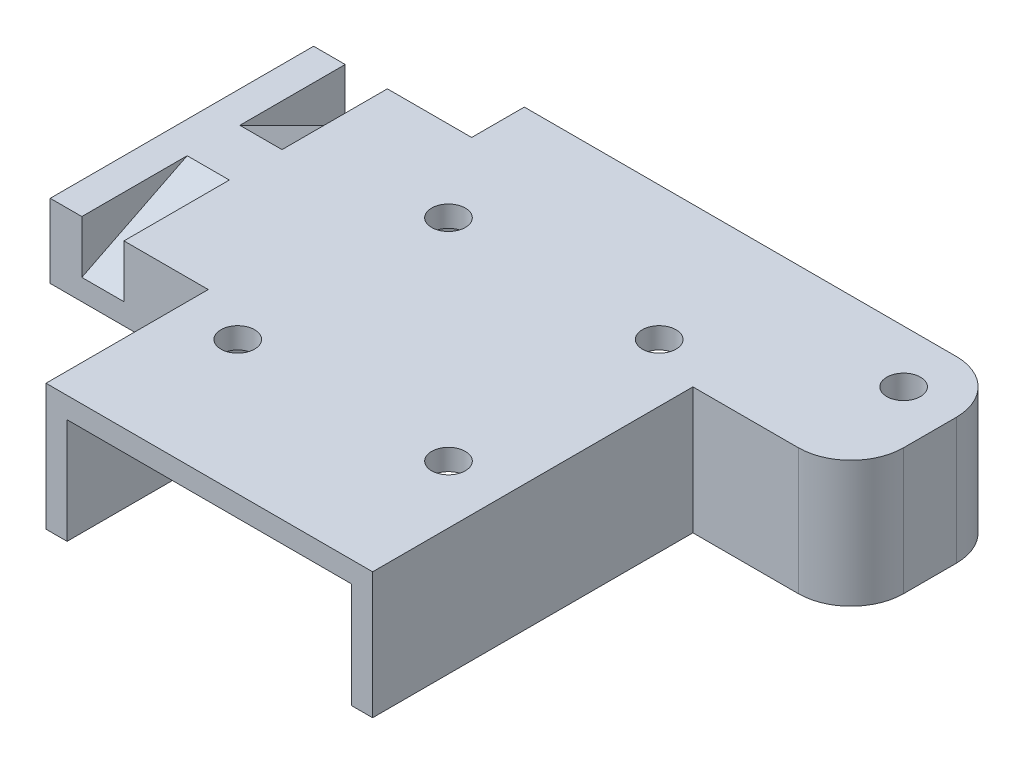
ISO-10303-21;
HEADER;
FILE_DESCRIPTION(('STEP AP214'),'2;1');
FILE_NAME('part.step','',(''),(''),'','','');
FILE_SCHEMA(('AUTOMOTIVE_DESIGN { 1 0 10303 214 1 1 1 1 }'));
ENDSEC;
DATA;
#1=APPLICATION_CONTEXT('core data for automotive mechanical design processes');
#2=APPLICATION_PROTOCOL_DEFINITION('international standard','automotive_design',2000,#1);
#3=PRODUCT_CONTEXT('',#1,'mechanical');
#4=PRODUCT('Part','Part','',(#3));
#5=PRODUCT_RELATED_PRODUCT_CATEGORY('part','',(#4));
#6=PRODUCT_DEFINITION_FORMATION('','',#4);
#7=PRODUCT_DEFINITION_CONTEXT('part definition',#1,'design');
#8=PRODUCT_DEFINITION('design','',#6,#7);
#9=PRODUCT_DEFINITION_SHAPE('','',#8);
#10=(LENGTH_UNIT() NAMED_UNIT(*) SI_UNIT(.MILLI.,.METRE.));
#11=(NAMED_UNIT(*) PLANE_ANGLE_UNIT() SI_UNIT($,.RADIAN.));
#12=(NAMED_UNIT(*) SI_UNIT($,.STERADIAN.) SOLID_ANGLE_UNIT());
#13=UNCERTAINTY_MEASURE_WITH_UNIT(LENGTH_MEASURE(1.E-05),#10,'distance_accuracy_value','');
#14=(GEOMETRIC_REPRESENTATION_CONTEXT(3) GLOBAL_UNCERTAINTY_ASSIGNED_CONTEXT((#13)) GLOBAL_UNIT_ASSIGNED_CONTEXT((#10,
#11,#12)) REPRESENTATION_CONTEXT('',''));
#15=CARTESIAN_POINT('',(0.,0.,0.));
#16=DIRECTION('',(0.,0.,1.));
#17=DIRECTION('',(1.,0.,0.));
#18=AXIS2_PLACEMENT_3D('',#15,#16,#17);
#19=CARTESIAN_POINT('',(62.,12.,-90.8));
#20=DIRECTION('',(0.,-1.,0.));
#21=DIRECTION('',(0.,0.,1.));
#22=AXIS2_PLACEMENT_3D('',#19,#20,#21);
#23=PLANE('',#22);
#24=CARTESIAN_POINT('',(36.5,12.,-58.1));
#25=DIRECTION('',(0.,1.,0.));
#26=DIRECTION('',(0.,0.,-1.));
#27=AXIS2_PLACEMENT_3D('',#24,#25,#26);
#28=CIRCLE('',#27,1.6);
#29=CARTESIAN_POINT('',(36.5,12.,-59.7));
#30=VERTEX_POINT('',#29);
#31=EDGE_CURVE('E372',#30,#30,#28,.T.);
#32=ORIENTED_EDGE('',*,*,#31,.F.);
#33=EDGE_LOOP('',(#32));
#34=FACE_BOUND('',#33,.T.);
#35=CARTESIAN_POINT('',(56.5,12.,-78.1));
#36=DIRECTION('',(0.,1.,0.));
#37=DIRECTION('',(0.,0.,-1.));
#38=AXIS2_PLACEMENT_3D('',#35,#36,#37);
#39=CIRCLE('',#38,1.6);
#40=CARTESIAN_POINT('',(56.5,12.,-79.7));
#41=VERTEX_POINT('',#40);
#42=EDGE_CURVE('E363',#41,#41,#39,.T.);
#43=ORIENTED_EDGE('',*,*,#42,.F.);
#44=EDGE_LOOP('',(#43));
#45=FACE_BOUND('',#44,.T.);
#46=CARTESIAN_POINT('',(36.5,12.,-78.1));
#47=DIRECTION('',(0.,1.,0.));
#48=DIRECTION('',(0.,0.,-1.));
#49=AXIS2_PLACEMENT_3D('',#46,#47,#48);
#50=CIRCLE('',#49,1.6);
#51=CARTESIAN_POINT('',(36.5,12.,-79.7));
#52=VERTEX_POINT('',#51);
#53=EDGE_CURVE('E367',#52,#52,#50,.T.);
#54=ORIENTED_EDGE('',*,*,#53,.F.);
#55=EDGE_LOOP('',(#54));
#56=FACE_BOUND('',#55,.T.);
#57=CARTESIAN_POINT('',(56.5,12.,-58.1));
#58=DIRECTION('',(0.,1.,0.));
#59=DIRECTION('',(0.,0.,-1.));
#60=AXIS2_PLACEMENT_3D('',#57,#58,#59);
#61=CIRCLE('',#60,1.6);
#62=CARTESIAN_POINT('',(56.5,12.,-59.7));
#63=VERTEX_POINT('',#62);
#64=EDGE_CURVE('E368',#63,#63,#61,.T.);
#65=ORIENTED_EDGE('',*,*,#64,.F.);
#66=EDGE_LOOP('',(#65));
#67=FACE_BOUND('',#66,.T.);
#68=CARTESIAN_POINT('',(72.,12.,-85.8));
#69=DIRECTION('',(0.,1.,0.));
#70=DIRECTION('',(0.,0.,-1.));
#71=AXIS2_PLACEMENT_3D('',#68,#69,#70);
#72=CIRCLE('',#71,1.6);
#73=CARTESIAN_POINT('',(72.,12.,-87.4));
#74=VERTEX_POINT('',#73);
#75=EDGE_CURVE('E336',#74,#74,#72,.T.);
#76=ORIENTED_EDGE('',*,*,#75,.F.);
#77=EDGE_LOOP('',(#76));
#78=FACE_BOUND('',#77,.T.);
#79=DIRECTION('',(1.,0.,0.));
#80=VECTOR('',#79,1.);
#81=CARTESIAN_POINT('',(16.,12.,-85.8));
#82=LINE('',#81,#80);
#83=CARTESIAN_POINT('',(23.,12.,-85.8));
#84=VERTEX_POINT('',#83);
#85=CARTESIAN_POINT('',(31.,12.,-85.8));
#86=VERTEX_POINT('',#85);
#87=EDGE_CURVE('E298',#84,#86,#82,.T.);
#88=ORIENTED_EDGE('',*,*,#87,.F.);
#89=DIRECTION('',(0.,0.,-1.));
#90=VECTOR('',#89,1.);
#91=CARTESIAN_POINT('',(23.,12.,-75.8));
#92=LINE('',#91,#90);
#93=CARTESIAN_POINT('',(23.,12.,-75.8));
#94=VERTEX_POINT('',#93);
#95=EDGE_CURVE('E226',#94,#84,#92,.T.);
#96=ORIENTED_EDGE('',*,*,#95,.F.);
#97=DIRECTION('',(-1.,0.,0.));
#98=VECTOR('',#97,1.);
#99=CARTESIAN_POINT('',(23.,12.,-75.8));
#100=LINE('',#99,#98);
#101=CARTESIAN_POINT('',(19.,12.,-75.8));
#102=VERTEX_POINT('',#101);
#103=EDGE_CURVE('E221',#94,#102,#100,.T.);
#104=ORIENTED_EDGE('',*,*,#103,.T.);
#105=DIRECTION('',(0.,0.,-1.));
#106=VECTOR('',#105,1.);
#107=CARTESIAN_POINT('',(19.,12.,-75.8));
#108=LINE('',#107,#106);
#109=CARTESIAN_POINT('',(19.,12.,-85.8));
#110=VERTEX_POINT('',#109);
#111=EDGE_CURVE('E234',#102,#110,#108,.T.);
#112=ORIENTED_EDGE('',*,*,#111,.T.);
#113=CARTESIAN_POINT('',(16.,12.,-85.8));
#114=VERTEX_POINT('',#113);
#115=EDGE_CURVE('E316',#114,#110,#82,.T.);
#116=ORIENTED_EDGE('',*,*,#115,.F.);
#117=DIRECTION('',(0.,0.,-1.));
#118=VECTOR('',#117,1.);
#119=CARTESIAN_POINT('',(16.,12.,-60.8));
#120=LINE('',#119,#118);
#121=CARTESIAN_POINT('',(16.,12.,-60.8));
#122=VERTEX_POINT('',#121);
#123=EDGE_CURVE('E294',#122,#114,#120,.T.);
#124=ORIENTED_EDGE('',*,*,#123,.F.);
#125=DIRECTION('',(1.,0.,0.));
#126=VECTOR('',#125,1.);
#127=CARTESIAN_POINT('',(16.,12.,-60.8));
#128=LINE('',#127,#126);
#129=CARTESIAN_POINT('',(19.,12.,-60.8));
#130=VERTEX_POINT('',#129);
#131=EDGE_CURVE('E320',#122,#130,#128,.T.);
#132=ORIENTED_EDGE('',*,*,#131,.T.);
#133=DIRECTION('',(0.,0.,-1.));
#134=VECTOR('',#133,1.);
#135=CARTESIAN_POINT('',(19.,12.,-70.8));
#136=LINE('',#135,#134);
#137=CARTESIAN_POINT('',(19.,12.,-70.8));
#138=VERTEX_POINT('',#137);
#139=EDGE_CURVE('E262',#130,#138,#136,.T.);
#140=ORIENTED_EDGE('',*,*,#139,.T.);
#141=DIRECTION('',(-1.,0.,0.));
#142=VECTOR('',#141,1.);
#143=CARTESIAN_POINT('',(23.,12.,-70.8));
#144=LINE('',#143,#142);
#145=CARTESIAN_POINT('',(23.,12.,-70.8));
#146=VERTEX_POINT('',#145);
#147=EDGE_CURVE('E259',#146,#138,#144,.T.);
#148=ORIENTED_EDGE('',*,*,#147,.F.);
#149=DIRECTION('',(0.,0.,-1.));
#150=VECTOR('',#149,1.);
#151=CARTESIAN_POINT('',(23.,12.,-70.8));
#152=LINE('',#151,#150);
#153=CARTESIAN_POINT('',(23.,12.,-60.8));
#154=VERTEX_POINT('',#153);
#155=EDGE_CURVE('E251',#154,#146,#152,.T.);
#156=ORIENTED_EDGE('',*,*,#155,.F.);
#157=CARTESIAN_POINT('',(31.,12.,-60.8));
#158=VERTEX_POINT('',#157);
#159=EDGE_CURVE('E319',#154,#158,#128,.T.);
#160=ORIENTED_EDGE('',*,*,#159,.T.);
#161=DIRECTION('',(0.,0.,1.));
#162=VECTOR('',#161,1.);
#163=CARTESIAN_POINT('',(31.,12.,-90.8));
#164=LINE('',#163,#162);
#165=CARTESIAN_POINT('',(31.,12.,-45.4));
#166=VERTEX_POINT('',#165);
#167=EDGE_CURVE('E426',#158,#166,#164,.T.);
#168=ORIENTED_EDGE('',*,*,#167,.T.);
#169=DIRECTION('',(1.,0.,0.));
#170=VECTOR('',#169,1.);
#171=CARTESIAN_POINT('',(62.,12.,-45.4));
#172=LINE('',#171,#170);
#173=CARTESIAN_POINT('',(62.,12.,-45.4));
#174=VERTEX_POINT('',#173);
#175=EDGE_CURVE('E431',#166,#174,#172,.T.);
#176=ORIENTED_EDGE('',*,*,#175,.T.);
#177=DIRECTION('',(0.,0.,-1.));
#178=VECTOR('',#177,1.);
#179=CARTESIAN_POINT('',(62.,12.,-90.8));
#180=LINE('',#179,#178);
#181=CARTESIAN_POINT('',(62.,12.,-75.8));
#182=VERTEX_POINT('',#181);
#183=EDGE_CURVE('E417',#174,#182,#180,.T.);
#184=ORIENTED_EDGE('',*,*,#183,.T.);
#185=DIRECTION('',(-1.,0.,0.));
#186=VECTOR('',#185,1.);
#187=CARTESIAN_POINT('',(77.,12.,-75.8));
#188=LINE('',#187,#186);
#189=CARTESIAN_POINT('',(72.,12.,-75.8));
#190=VERTEX_POINT('',#189);
#191=EDGE_CURVE('E353',#190,#182,#188,.T.);
#192=ORIENTED_EDGE('',*,*,#191,.F.);
#193=CARTESIAN_POINT('',(72.,12.,-80.8));
#194=DIRECTION('',(0.,-1.,0.));
#195=DIRECTION('',(0.,0.,1.));
#196=AXIS2_PLACEMENT_3D('',#193,#194,#195);
#197=CIRCLE('',#196,5.);
#198=CARTESIAN_POINT('',(77.,12.,-80.8));
#199=VERTEX_POINT('',#198);
#200=EDGE_CURVE('E500',#190,#199,#197,.F.);
#201=ORIENTED_EDGE('',*,*,#200,.T.);
#202=DIRECTION('',(0.,0.,1.));
#203=VECTOR('',#202,1.);
#204=CARTESIAN_POINT('',(77.,12.,-75.8));
#205=LINE('',#204,#203);
#206=CARTESIAN_POINT('',(77.,12.,-85.8));
#207=VERTEX_POINT('',#206);
#208=EDGE_CURVE('E349',#207,#199,#205,.T.);
#209=ORIENTED_EDGE('',*,*,#208,.F.);
#210=CARTESIAN_POINT('',(72.,12.,-85.8));
#211=DIRECTION('',(0.,-1.,0.));
#212=DIRECTION('',(0.,0.,1.));
#213=AXIS2_PLACEMENT_3D('',#210,#211,#212);
#214=CIRCLE('',#213,5.);
#215=CARTESIAN_POINT('',(72.,12.,-90.8));
#216=VERTEX_POINT('',#215);
#217=EDGE_CURVE('E496',#207,#216,#214,.F.);
#218=ORIENTED_EDGE('',*,*,#217,.T.);
#219=DIRECTION('',(-1.,0.,0.));
#220=VECTOR('',#219,1.);
#221=CARTESIAN_POINT('',(62.,12.,-90.8));
#222=LINE('',#221,#220);
#223=CARTESIAN_POINT('',(31.,12.,-90.8));
#224=VERTEX_POINT('',#223);
#225=EDGE_CURVE('E421',#216,#224,#222,.T.);
#226=ORIENTED_EDGE('',*,*,#225,.T.);
#227=EDGE_CURVE('E427',#224,#86,#164,.T.);
#228=ORIENTED_EDGE('',*,*,#227,.T.);
#229=EDGE_LOOP('',(#88,#96,#104,#112,#116,#124,#132,#140,#148,#156,#160,#168,#176,#184,#192,
#201,#209,#218,#226,#228));
#230=FACE_BOUND('',#229,.T.);
#231=ADVANCED_FACE('F39',(#34,#45,#56,#67,#78,#230),#23,.F.);
#232=CARTESIAN_POINT('',(16.,0.,-60.8));
#233=DIRECTION('',(0.,0.,-1.));
#234=DIRECTION('',(-1.,0.,0.));
#235=AXIS2_PLACEMENT_3D('',#232,#233,#234);
#236=PLANE('',#235);
#237=DIRECTION('',(0.,1.,0.));
#238=VECTOR('',#237,1.);
#239=CARTESIAN_POINT('',(23.,12.,-60.8));
#240=LINE('',#239,#238);
#241=CARTESIAN_POINT('',(23.,7.,-60.8));
#242=VERTEX_POINT('',#241);
#243=EDGE_CURVE('E248',#242,#154,#240,.T.);
#244=ORIENTED_EDGE('',*,*,#243,.F.);
#245=DIRECTION('',(-1.,0.,0.));
#246=VECTOR('',#245,1.);
#247=CARTESIAN_POINT('',(23.,7.,-60.8));
#248=LINE('',#247,#246);
#249=CARTESIAN_POINT('',(19.,7.,-60.8));
#250=VERTEX_POINT('',#249);
#251=EDGE_CURVE('E268',#242,#250,#248,.T.);
#252=ORIENTED_EDGE('',*,*,#251,.T.);
#253=DIRECTION('',(0.,1.,0.));
#254=VECTOR('',#253,1.);
#255=CARTESIAN_POINT('',(19.,12.,-60.8));
#256=LINE('',#255,#254);
#257=EDGE_CURVE('E63',#250,#130,#256,.T.);
#258=ORIENTED_EDGE('',*,*,#257,.T.);
#259=ORIENTED_EDGE('',*,*,#131,.F.);
#260=DIRECTION('',(0.,1.,0.));
#261=VECTOR('',#260,1.);
#262=CARTESIAN_POINT('',(16.,0.,-60.8));
#263=LINE('',#262,#261);
#264=CARTESIAN_POINT('',(16.,5.,-60.8));
#265=VERTEX_POINT('',#264);
#266=EDGE_CURVE('E291',#265,#122,#263,.T.);
#267=ORIENTED_EDGE('',*,*,#266,.F.);
#268=DIRECTION('',(1.,0.,0.));
#269=VECTOR('',#268,1.);
#270=CARTESIAN_POINT('',(31.,5.,-60.8));
#271=LINE('',#270,#269);
#272=CARTESIAN_POINT('',(31.,5.,-60.8));
#273=VERTEX_POINT('',#272);
#274=EDGE_CURVE('E517',#265,#273,#271,.T.);
#275=ORIENTED_EDGE('',*,*,#274,.T.);
#276=DIRECTION('',(0.,1.,0.));
#277=VECTOR('',#276,1.);
#278=CARTESIAN_POINT('',(31.,0.,-60.8));
#279=LINE('',#278,#277);
#280=EDGE_CURVE('E279',#273,#158,#279,.T.);
#281=ORIENTED_EDGE('',*,*,#280,.T.);
#282=ORIENTED_EDGE('',*,*,#159,.F.);
#283=EDGE_LOOP('',(#244,#252,#258,#259,#267,#275,#281,#282));
#284=FACE_BOUND('',#283,.T.);
#285=ADVANCED_FACE('F611',(#284),#236,.F.);
#286=CARTESIAN_POINT('',(31.,12.,-90.8));
#287=DIRECTION('',(1.,0.,0.));
#288=DIRECTION('',(0.,0.,-1.));
#289=AXIS2_PLACEMENT_3D('',#286,#287,#288);
#290=PLANE('',#289);
#291=DIRECTION('',(0.,-1.,0.));
#292=VECTOR('',#291,1.);
#293=CARTESIAN_POINT('',(31.,12.,-85.8));
#294=LINE('',#293,#292);
#295=CARTESIAN_POINT('',(31.,5.,-85.8));
#296=VERTEX_POINT('',#295);
#297=EDGE_CURVE('E243',#86,#296,#294,.T.);
#298=ORIENTED_EDGE('',*,*,#297,.F.);
#299=ORIENTED_EDGE('',*,*,#227,.F.);
#300=DIRECTION('',(0.,-1.,0.));
#301=VECTOR('',#300,1.);
#302=CARTESIAN_POINT('',(31.,12.,-90.8));
#303=LINE('',#302,#301);
#304=CARTESIAN_POINT('',(31.,0.,-90.8));
#305=VERTEX_POINT('',#304);
#306=EDGE_CURVE('E461',#224,#305,#303,.T.);
#307=ORIENTED_EDGE('',*,*,#306,.T.);
#308=DIRECTION('',(0.,0.,1.));
#309=VECTOR('',#308,1.);
#310=CARTESIAN_POINT('',(31.,0.,-90.8));
#311=LINE('',#310,#309);
#312=CARTESIAN_POINT('',(31.,0.,-80.8));
#313=VERTEX_POINT('',#312);
#314=EDGE_CURVE('E445',#305,#313,#311,.T.);
#315=ORIENTED_EDGE('',*,*,#314,.T.);
#316=DIRECTION('',(0.,0.707106781186548,-0.707106781186547));
#317=VECTOR('',#316,1.);
#318=CARTESIAN_POINT('',(31.,11.,-91.8));
#319=LINE('',#318,#317);
#320=EDGE_CURVE('E48',#313,#296,#319,.T.);
#321=ORIENTED_EDGE('',*,*,#320,.T.);
#322=EDGE_LOOP('',(#298,#299,#307,#315,#321));
#323=FACE_BOUND('',#322,.T.);
#324=ADVANCED_FACE('F524',(#323),#290,.F.);
#325=ORIENTED_EDGE('',*,*,#280,.F.);
#326=DIRECTION('',(0.,-0.707106781186547,-0.707106781186549));
#327=VECTOR('',#326,1.);
#328=CARTESIAN_POINT('',(31.,-6.50000000000001,-72.3));
#329=LINE('',#328,#327);
#330=CARTESIAN_POINT('',(31.,0.,-65.8));
#331=VERTEX_POINT('',#330);
#332=EDGE_CURVE('E11',#273,#331,#329,.T.);
#333=ORIENTED_EDGE('',*,*,#332,.T.);
#334=CARTESIAN_POINT('',(31.,0.,-45.4));
#335=VERTEX_POINT('',#334);
#336=EDGE_CURVE('E444',#331,#335,#311,.T.);
#337=ORIENTED_EDGE('',*,*,#336,.T.);
#338=DIRECTION('',(0.,-1.,0.));
#339=VECTOR('',#338,1.);
#340=CARTESIAN_POINT('',(31.,12.,-45.4));
#341=LINE('',#340,#339);
#342=EDGE_CURVE('E457',#166,#335,#341,.T.);
#343=ORIENTED_EDGE('',*,*,#342,.F.);
#344=ORIENTED_EDGE('',*,*,#167,.F.);
#345=EDGE_LOOP('',(#325,#333,#337,#343,#344));
#346=FACE_BOUND('',#345,.T.);
#347=ADVANCED_FACE('F547',(#346),#290,.F.);
#348=DIRECTION('',(0.,-1.,0.));
#349=VECTOR('',#348,1.);
#350=CARTESIAN_POINT('',(31.,4.7,-65.8));
#351=LINE('',#350,#349);
#352=CARTESIAN_POINT('',(31.,4.7,-65.8));
#353=VERTEX_POINT('',#352);
#354=EDGE_CURVE('E310',#353,#331,#351,.T.);
#355=ORIENTED_EDGE('',*,*,#354,.F.);
#356=DIRECTION('',(0.,0.,1.));
#357=VECTOR('',#356,1.);
#358=CARTESIAN_POINT('',(31.,4.7,-80.8));
#359=LINE('',#358,#357);
#360=CARTESIAN_POINT('',(31.,4.7,-80.8));
#361=VERTEX_POINT('',#360);
#362=EDGE_CURVE('E306',#361,#353,#359,.T.);
#363=ORIENTED_EDGE('',*,*,#362,.F.);
#364=DIRECTION('',(0.,1.,0.));
#365=VECTOR('',#364,1.);
#366=CARTESIAN_POINT('',(31.,0.,-80.8));
#367=LINE('',#366,#365);
#368=EDGE_CURVE('E302',#313,#361,#367,.T.);
#369=ORIENTED_EDGE('',*,*,#368,.F.);
#370=EDGE_CURVE('E450',#313,#331,#311,.T.);
#371=ORIENTED_EDGE('',*,*,#370,.T.);
#372=EDGE_LOOP('',(#355,#363,#369,#371));
#373=FACE_BOUND('',#372,.T.);
#374=ADVANCED_FACE('F586',(#373),#290,.F.);
#375=CARTESIAN_POINT('',(62.,12.,-90.8));
#376=DIRECTION('',(-1.,0.,0.));
#377=DIRECTION('',(0.,0.,1.));
#378=AXIS2_PLACEMENT_3D('',#375,#376,#377);
#379=PLANE('',#378);
#380=DIRECTION('',(0.,-1.,0.));
#381=VECTOR('',#380,1.);
#382=CARTESIAN_POINT('',(62.,12.,-75.8));
#383=LINE('',#382,#381);
#384=CARTESIAN_POINT('',(62.,0.,-75.8));
#385=VERTEX_POINT('',#384);
#386=EDGE_CURVE('E344',#182,#385,#383,.T.);
#387=ORIENTED_EDGE('',*,*,#386,.F.);
#388=ORIENTED_EDGE('',*,*,#183,.F.);
#389=DIRECTION('',(0.,-1.,0.));
#390=VECTOR('',#389,1.);
#391=CARTESIAN_POINT('',(62.,12.,-45.4));
#392=LINE('',#391,#390);
#393=CARTESIAN_POINT('',(62.,0.,-45.4));
#394=VERTEX_POINT('',#393);
#395=EDGE_CURVE('E435',#174,#394,#392,.T.);
#396=ORIENTED_EDGE('',*,*,#395,.T.);
#397=DIRECTION('',(0.,0.,-1.));
#398=VECTOR('',#397,1.);
#399=CARTESIAN_POINT('',(62.,0.,-90.8));
#400=LINE('',#399,#398);
#401=EDGE_CURVE('E407',#394,#385,#400,.T.);
#402=ORIENTED_EDGE('',*,*,#401,.T.);
#403=EDGE_LOOP('',(#387,#388,#396,#402));
#404=FACE_BOUND('',#403,.T.);
#405=ADVANCED_FACE('F555',(#404),#379,.F.);
#406=CARTESIAN_POINT('',(62.,0.,-90.8));
#407=DIRECTION('',(0.,-1.,0.));
#408=DIRECTION('',(0.,0.,1.));
#409=AXIS2_PLACEMENT_3D('',#406,#407,#408);
#410=PLANE('',#409);
#411=CARTESIAN_POINT('',(72.,0.,-85.8));
#412=DIRECTION('',(0.,-1.,0.));
#413=DIRECTION('',(0.,0.,1.));
#414=AXIS2_PLACEMENT_3D('',#411,#412,#413);
#415=CIRCLE('',#414,1.6);
#416=CARTESIAN_POINT('',(72.,0.,-84.2));
#417=VERTEX_POINT('',#416);
#418=EDGE_CURVE('E340',#417,#417,#415,.T.);
#419=ORIENTED_EDGE('',*,*,#418,.F.);
#420=EDGE_LOOP('',(#419));
#421=FACE_BOUND('',#420,.T.);
#422=DIRECTION('',(0.,0.,-1.));
#423=VECTOR('',#422,1.);
#424=CARTESIAN_POINT('',(77.,0.,-75.8));
#425=LINE('',#424,#423);
#426=CARTESIAN_POINT('',(77.,0.,-80.8));
#427=VERTEX_POINT('',#426);
#428=CARTESIAN_POINT('',(77.,0.,-85.8));
#429=VERTEX_POINT('',#428);
#430=EDGE_CURVE('E345',#427,#429,#425,.T.);
#431=ORIENTED_EDGE('',*,*,#430,.F.);
#432=CARTESIAN_POINT('',(72.,0.,-80.8));
#433=DIRECTION('',(0.,-1.,0.));
#434=DIRECTION('',(0.,0.,1.));
#435=AXIS2_PLACEMENT_3D('',#432,#433,#434);
#436=CIRCLE('',#435,5.);
#437=CARTESIAN_POINT('',(72.,0.,-75.8));
#438=VERTEX_POINT('',#437);
#439=EDGE_CURVE('E489',#427,#438,#436,.T.);
#440=ORIENTED_EDGE('',*,*,#439,.T.);
#441=DIRECTION('',(-1.,0.,0.));
#442=VECTOR('',#441,1.);
#443=CARTESIAN_POINT('',(77.,0.,-75.8));
#444=LINE('',#443,#442);
#445=EDGE_CURVE('E360',#438,#385,#444,.T.);
#446=ORIENTED_EDGE('',*,*,#445,.T.);
#447=ORIENTED_EDGE('',*,*,#401,.F.);
#448=DIRECTION('',(1.,0.,0.));
#449=VECTOR('',#448,1.);
#450=CARTESIAN_POINT('',(62.,0.,-45.4));
#451=LINE('',#450,#449);
#452=CARTESIAN_POINT('',(60.,0.,-45.4));
#453=VERTEX_POINT('',#452);
#454=EDGE_CURVE('E449',#453,#394,#451,.T.);
#455=ORIENTED_EDGE('',*,*,#454,.F.);
#456=DIRECTION('',(0.,0.,-1.));
#457=VECTOR('',#456,1.);
#458=CARTESIAN_POINT('',(60.,0.,-45.4));
#459=LINE('',#458,#457);
#460=CARTESIAN_POINT('',(60.,0.,-90.8));
#461=VERTEX_POINT('',#460);
#462=EDGE_CURVE('E392',#453,#461,#459,.T.);
#463=ORIENTED_EDGE('',*,*,#462,.T.);
#464=DIRECTION('',(-1.,0.,0.));
#465=VECTOR('',#464,1.);
#466=CARTESIAN_POINT('',(62.,0.,-90.8));
#467=LINE('',#466,#465);
#468=CARTESIAN_POINT('',(72.,0.,-90.8));
#469=VERTEX_POINT('',#468);
#470=EDGE_CURVE('E440',#469,#461,#467,.T.);
#471=ORIENTED_EDGE('',*,*,#470,.F.);
#472=CARTESIAN_POINT('',(72.,0.,-85.8));
#473=DIRECTION('',(0.,-1.,0.));
#474=DIRECTION('',(0.,0.,1.));
#475=AXIS2_PLACEMENT_3D('',#472,#473,#474);
#476=CIRCLE('',#475,5.);
#477=EDGE_CURVE('E485',#469,#429,#476,.T.);
#478=ORIENTED_EDGE('',*,*,#477,.T.);
#479=EDGE_LOOP('',(#431,#440,#446,#447,#455,#463,#471,#478));
#480=FACE_BOUND('',#479,.T.);
#481=ADVANCED_FACE('F626',(#421,#480),#410,.T.);
#482=CARTESIAN_POINT('',(62.,12.,-90.8));
#483=DIRECTION('',(0.,0.,1.));
#484=DIRECTION('',(1.,0.,0.));
#485=AXIS2_PLACEMENT_3D('',#482,#483,#484);
#486=PLANE('',#485);
#487=ORIENTED_EDGE('',*,*,#225,.F.);
#488=DIRECTION('',(0.,1.,0.));
#489=VECTOR('',#488,1.);
#490=CARTESIAN_POINT('',(72.,0.,-90.8));
#491=LINE('',#490,#489);
#492=EDGE_CURVE('E504',#216,#469,#491,.F.);
#493=ORIENTED_EDGE('',*,*,#492,.T.);
#494=ORIENTED_EDGE('',*,*,#470,.T.);
#495=DIRECTION('',(0.,-1.,0.));
#496=VECTOR('',#495,1.);
#497=CARTESIAN_POINT('',(60.,0.,-90.8));
#498=LINE('',#497,#496);
#499=CARTESIAN_POINT('',(60.,10.,-90.8));
#500=VERTEX_POINT('',#499);
#501=EDGE_CURVE('E393',#500,#461,#498,.T.);
#502=ORIENTED_EDGE('',*,*,#501,.F.);
#503=DIRECTION('',(1.,0.,0.));
#504=VECTOR('',#503,1.);
#505=CARTESIAN_POINT('',(60.,10.,-90.8));
#506=LINE('',#505,#504);
#507=CARTESIAN_POINT('',(33.,10.,-90.8));
#508=VERTEX_POINT('',#507);
#509=EDGE_CURVE('E384',#508,#500,#506,.T.);
#510=ORIENTED_EDGE('',*,*,#509,.F.);
#511=DIRECTION('',(0.,1.,0.));
#512=VECTOR('',#511,1.);
#513=CARTESIAN_POINT('',(33.,0.,-90.8));
#514=LINE('',#513,#512);
#515=CARTESIAN_POINT('',(33.,0.,-90.8));
#516=VERTEX_POINT('',#515);
#517=EDGE_CURVE('E396',#516,#508,#514,.T.);
#518=ORIENTED_EDGE('',*,*,#517,.F.);
#519=EDGE_CURVE('E439',#516,#305,#467,.T.);
#520=ORIENTED_EDGE('',*,*,#519,.T.);
#521=ORIENTED_EDGE('',*,*,#306,.F.);
#522=EDGE_LOOP('',(#487,#493,#494,#502,#510,#518,#520,#521));
#523=FACE_BOUND('',#522,.T.);
#524=ADVANCED_FACE('F575',(#523),#486,.F.);
#525=CARTESIAN_POINT('',(62.,12.,-45.4));
#526=DIRECTION('',(0.,0.,-1.));
#527=DIRECTION('',(-1.,0.,0.));
#528=AXIS2_PLACEMENT_3D('',#525,#526,#527);
#529=PLANE('',#528);
#530=DIRECTION('',(1.,0.,0.));
#531=VECTOR('',#530,1.);
#532=CARTESIAN_POINT('',(60.,10.,-45.4));
#533=LINE('',#532,#531);
#534=CARTESIAN_POINT('',(33.,10.,-45.4));
#535=VERTEX_POINT('',#534);
#536=CARTESIAN_POINT('',(60.,10.,-45.4));
#537=VERTEX_POINT('',#536);
#538=EDGE_CURVE('E388',#535,#537,#533,.T.);
#539=ORIENTED_EDGE('',*,*,#538,.T.);
#540=DIRECTION('',(0.,-1.,0.));
#541=VECTOR('',#540,1.);
#542=CARTESIAN_POINT('',(60.,0.,-45.4));
#543=LINE('',#542,#541);
#544=EDGE_CURVE('E380',#537,#453,#543,.T.);
#545=ORIENTED_EDGE('',*,*,#544,.T.);
#546=ORIENTED_EDGE('',*,*,#454,.T.);
#547=ORIENTED_EDGE('',*,*,#395,.F.);
#548=ORIENTED_EDGE('',*,*,#175,.F.);
#549=ORIENTED_EDGE('',*,*,#342,.T.);
#550=CARTESIAN_POINT('',(33.,0.,-45.4));
#551=VERTEX_POINT('',#550);
#552=EDGE_CURVE('E422',#335,#551,#451,.T.);
#553=ORIENTED_EDGE('',*,*,#552,.T.);
#554=DIRECTION('',(0.,1.,0.));
#555=VECTOR('',#554,1.);
#556=CARTESIAN_POINT('',(33.,0.,-45.4));
#557=LINE('',#556,#555);
#558=EDGE_CURVE('E383',#551,#535,#557,.T.);
#559=ORIENTED_EDGE('',*,*,#558,.T.);
#560=EDGE_LOOP('',(#539,#545,#546,#547,#548,#549,#553,#559));
#561=FACE_BOUND('',#560,.T.);
#562=ADVANCED_FACE('F550',(#561),#529,.F.);
#563=ORIENTED_EDGE('',*,*,#370,.F.);
#564=ORIENTED_EDGE('',*,*,#314,.F.);
#565=ORIENTED_EDGE('',*,*,#519,.F.);
#566=DIRECTION('',(0.,0.,-1.));
#567=VECTOR('',#566,1.);
#568=CARTESIAN_POINT('',(33.,0.,-45.4));
#569=LINE('',#568,#567);
#570=EDGE_CURVE('E411',#551,#516,#569,.T.);
#571=ORIENTED_EDGE('',*,*,#570,.F.);
#572=ORIENTED_EDGE('',*,*,#552,.F.);
#573=ORIENTED_EDGE('',*,*,#336,.F.);
#574=EDGE_LOOP('',(#563,#564,#565,#571,#572,#573));
#575=FACE_BOUND('',#574,.T.);
#576=ADVANCED_FACE('F581',(#575),#410,.T.);
#577=CARTESIAN_POINT('',(60.,0.,-45.4));
#578=DIRECTION('',(1.,0.,0.));
#579=DIRECTION('',(0.,0.,-1.));
#580=AXIS2_PLACEMENT_3D('',#577,#578,#579);
#581=PLANE('',#580);
#582=ORIENTED_EDGE('',*,*,#501,.T.);
#583=ORIENTED_EDGE('',*,*,#462,.F.);
#584=ORIENTED_EDGE('',*,*,#544,.F.);
#585=DIRECTION('',(0.,0.,-1.));
#586=VECTOR('',#585,1.);
#587=CARTESIAN_POINT('',(60.,10.,-45.4));
#588=LINE('',#587,#586);
#589=EDGE_CURVE('E404',#537,#500,#588,.T.);
#590=ORIENTED_EDGE('',*,*,#589,.T.);
#591=EDGE_LOOP('',(#582,#583,#584,#590));
#592=FACE_BOUND('',#591,.T.);
#593=ADVANCED_FACE('F622',(#592),#581,.F.);
#594=CARTESIAN_POINT('',(60.,10.,-45.4));
#595=DIRECTION('',(0.,1.,0.));
#596=DIRECTION('',(0.,0.,-1.));
#597=AXIS2_PLACEMENT_3D('',#594,#595,#596);
#598=PLANE('',#597);
#599=CARTESIAN_POINT('',(56.5,10.,-58.1));
#600=DIRECTION('',(0.,1.,0.));
#601=DIRECTION('',(0.,0.,-1.));
#602=AXIS2_PLACEMENT_3D('',#599,#600,#601);
#603=CIRCLE('',#602,1.6);
#604=CARTESIAN_POINT('',(56.5,10.,-59.7));
#605=VERTEX_POINT('',#604);
#606=EDGE_CURVE('E397',#605,#605,#603,.T.);
#607=ORIENTED_EDGE('',*,*,#606,.T.);
#608=EDGE_LOOP('',(#607));
#609=FACE_BOUND('',#608,.T.);
#610=CARTESIAN_POINT('',(36.5,10.,-78.1));
#611=DIRECTION('',(0.,1.,0.));
#612=DIRECTION('',(0.,0.,-1.));
#613=AXIS2_PLACEMENT_3D('',#610,#611,#612);
#614=CIRCLE('',#613,1.6);
#615=CARTESIAN_POINT('',(36.5,10.,-79.7));
#616=VERTEX_POINT('',#615);
#617=EDGE_CURVE('E473',#616,#616,#614,.T.);
#618=ORIENTED_EDGE('',*,*,#617,.T.);
#619=EDGE_LOOP('',(#618));
#620=FACE_BOUND('',#619,.T.);
#621=CARTESIAN_POINT('',(56.5,10.,-78.1));
#622=DIRECTION('',(0.,1.,0.));
#623=DIRECTION('',(0.,0.,-1.));
#624=AXIS2_PLACEMENT_3D('',#621,#622,#623);
#625=CIRCLE('',#624,1.6);
#626=CARTESIAN_POINT('',(56.5,10.,-79.7));
#627=VERTEX_POINT('',#626);
#628=EDGE_CURVE('E469',#627,#627,#625,.T.);
#629=ORIENTED_EDGE('',*,*,#628,.T.);
#630=EDGE_LOOP('',(#629));
#631=FACE_BOUND('',#630,.T.);
#632=CARTESIAN_POINT('',(36.5,10.,-58.1));
#633=DIRECTION('',(0.,1.,0.));
#634=DIRECTION('',(0.,0.,-1.));
#635=AXIS2_PLACEMENT_3D('',#632,#633,#634);
#636=CIRCLE('',#635,1.6);
#637=CARTESIAN_POINT('',(36.5,10.,-59.7));
#638=VERTEX_POINT('',#637);
#639=EDGE_CURVE('E379',#638,#638,#636,.T.);
#640=ORIENTED_EDGE('',*,*,#639,.T.);
#641=EDGE_LOOP('',(#640));
#642=FACE_BOUND('',#641,.T.);
#643=ORIENTED_EDGE('',*,*,#509,.T.);
#644=ORIENTED_EDGE('',*,*,#589,.F.);
#645=ORIENTED_EDGE('',*,*,#538,.F.);
#646=DIRECTION('',(0.,0.,-1.));
#647=VECTOR('',#646,1.);
#648=CARTESIAN_POINT('',(33.,10.,-45.4));
#649=LINE('',#648,#647);
#650=EDGE_CURVE('E408',#535,#508,#649,.T.);
#651=ORIENTED_EDGE('',*,*,#650,.T.);
#652=EDGE_LOOP('',(#643,#644,#645,#651));
#653=FACE_BOUND('',#652,.T.);
#654=ADVANCED_FACE('F688',(#609,#620,#631,#642,#653),#598,.F.);
#655=CARTESIAN_POINT('',(33.,0.,-45.4));
#656=DIRECTION('',(-1.,0.,0.));
#657=DIRECTION('',(0.,0.,1.));
#658=AXIS2_PLACEMENT_3D('',#655,#656,#657);
#659=PLANE('',#658);
#660=ORIENTED_EDGE('',*,*,#517,.T.);
#661=ORIENTED_EDGE('',*,*,#650,.F.);
#662=ORIENTED_EDGE('',*,*,#558,.F.);
#663=ORIENTED_EDGE('',*,*,#570,.T.);
#664=EDGE_LOOP('',(#660,#661,#662,#663));
#665=FACE_BOUND('',#664,.T.);
#666=ADVANCED_FACE('F686',(#665),#659,.F.);
#667=CARTESIAN_POINT('',(36.5,2.,-58.1));
#668=DIRECTION('',(0.,1.,0.));
#669=DIRECTION('',(0.,0.,-1.));
#670=AXIS2_PLACEMENT_3D('',#667,#668,#669);
#671=CYLINDRICAL_SURFACE('',#670,1.6);
#672=ORIENTED_EDGE('',*,*,#31,.T.);
#673=EDGE_LOOP('',(#672));
#674=FACE_BOUND('',#673,.T.);
#675=ORIENTED_EDGE('',*,*,#639,.F.);
#676=EDGE_LOOP('',(#675));
#677=FACE_BOUND('',#676,.T.);
#678=ADVANCED_FACE('F676',(#674,#677),#671,.F.);
#679=CARTESIAN_POINT('',(56.5,2.,-78.1));
#680=DIRECTION('',(0.,1.,0.));
#681=DIRECTION('',(0.,0.,-1.));
#682=AXIS2_PLACEMENT_3D('',#679,#680,#681);
#683=CYLINDRICAL_SURFACE('',#682,1.6);
#684=ORIENTED_EDGE('',*,*,#42,.T.);
#685=EDGE_LOOP('',(#684));
#686=FACE_BOUND('',#685,.T.);
#687=ORIENTED_EDGE('',*,*,#628,.F.);
#688=EDGE_LOOP('',(#687));
#689=FACE_BOUND('',#688,.T.);
#690=ADVANCED_FACE('F672',(#686,#689),#683,.F.);
#691=CARTESIAN_POINT('',(36.5,2.,-78.1));
#692=DIRECTION('',(0.,1.,0.));
#693=DIRECTION('',(0.,0.,-1.));
#694=AXIS2_PLACEMENT_3D('',#691,#692,#693);
#695=CYLINDRICAL_SURFACE('',#694,1.6);
#696=ORIENTED_EDGE('',*,*,#53,.T.);
#697=EDGE_LOOP('',(#696));
#698=FACE_BOUND('',#697,.T.);
#699=ORIENTED_EDGE('',*,*,#617,.F.);
#700=EDGE_LOOP('',(#699));
#701=FACE_BOUND('',#700,.T.);
#702=ADVANCED_FACE('F675',(#698,#701),#695,.F.);
#703=CARTESIAN_POINT('',(56.5,2.,-58.1));
#704=DIRECTION('',(0.,1.,0.));
#705=DIRECTION('',(0.,0.,-1.));
#706=AXIS2_PLACEMENT_3D('',#703,#704,#705);
#707=CYLINDRICAL_SURFACE('',#706,1.6);
#708=ORIENTED_EDGE('',*,*,#64,.T.);
#709=EDGE_LOOP('',(#708));
#710=FACE_BOUND('',#709,.T.);
#711=ORIENTED_EDGE('',*,*,#606,.F.);
#712=EDGE_LOOP('',(#711));
#713=FACE_BOUND('',#712,.T.);
#714=ADVANCED_FACE('F671',(#710,#713),#707,.F.);
#715=CARTESIAN_POINT('',(77.,12.,-75.8));
#716=DIRECTION('',(0.,0.,-1.));
#717=DIRECTION('',(-1.,0.,0.));
#718=AXIS2_PLACEMENT_3D('',#715,#716,#717);
#719=PLANE('',#718);
#720=ORIENTED_EDGE('',*,*,#445,.F.);
#721=DIRECTION('',(0.,-1.,0.));
#722=VECTOR('',#721,1.);
#723=CARTESIAN_POINT('',(72.,12.,-75.8));
#724=LINE('',#723,#722);
#725=EDGE_CURVE('E493',#438,#190,#724,.F.);
#726=ORIENTED_EDGE('',*,*,#725,.T.);
#727=ORIENTED_EDGE('',*,*,#191,.T.);
#728=ORIENTED_EDGE('',*,*,#386,.T.);
#729=EDGE_LOOP('',(#720,#726,#727,#728));
#730=FACE_BOUND('',#729,.T.);
#731=ADVANCED_FACE('F561',(#730),#719,.F.);
#732=CARTESIAN_POINT('',(77.,0.,-90.8));
#733=DIRECTION('',(1.,0.,0.));
#734=DIRECTION('',(0.,0.,-1.));
#735=AXIS2_PLACEMENT_3D('',#732,#733,#734);
#736=PLANE('',#735);
#737=ORIENTED_EDGE('',*,*,#208,.T.);
#738=DIRECTION('',(0.,-1.,0.));
#739=VECTOR('',#738,1.);
#740=CARTESIAN_POINT('',(77.,0.,-80.8));
#741=LINE('',#740,#739);
#742=EDGE_CURVE('E482',#199,#427,#741,.T.);
#743=ORIENTED_EDGE('',*,*,#742,.T.);
#744=ORIENTED_EDGE('',*,*,#430,.T.);
#745=DIRECTION('',(0.,1.,0.));
#746=VECTOR('',#745,1.);
#747=CARTESIAN_POINT('',(77.,12.,-85.8));
#748=LINE('',#747,#746);
#749=EDGE_CURVE('E465',#429,#207,#748,.T.);
#750=ORIENTED_EDGE('',*,*,#749,.T.);
#751=EDGE_LOOP('',(#737,#743,#744,#750));
#752=FACE_BOUND('',#751,.T.);
#753=ADVANCED_FACE('F567',(#752),#736,.T.);
#754=CARTESIAN_POINT('',(72.,-8.,-85.8));
#755=DIRECTION('',(0.,1.,0.));
#756=DIRECTION('',(0.,0.,-1.));
#757=AXIS2_PLACEMENT_3D('',#754,#755,#756);
#758=CYLINDRICAL_SURFACE('',#757,1.6);
#759=ORIENTED_EDGE('',*,*,#418,.T.);
#760=EDGE_LOOP('',(#759));
#761=FACE_BOUND('',#760,.T.);
#762=ORIENTED_EDGE('',*,*,#75,.T.);
#763=EDGE_LOOP('',(#762));
#764=FACE_BOUND('',#763,.T.);
#765=ADVANCED_FACE('F637',(#761,#764),#758,.F.);
#766=CARTESIAN_POINT('',(72.,0.,-80.8));
#767=DIRECTION('',(0.,1.,0.));
#768=DIRECTION('',(0.,0.,-1.));
#769=AXIS2_PLACEMENT_3D('',#766,#767,#768);
#770=CYLINDRICAL_SURFACE('',#769,5.);
#771=ORIENTED_EDGE('',*,*,#200,.F.);
#772=ORIENTED_EDGE('',*,*,#725,.F.);
#773=ORIENTED_EDGE('',*,*,#439,.F.);
#774=ORIENTED_EDGE('',*,*,#742,.F.);
#775=EDGE_LOOP('',(#771,#772,#773,#774));
#776=FACE_BOUND('',#775,.T.);
#777=ADVANCED_FACE('F564',(#776),#770,.T.);
#778=CARTESIAN_POINT('',(72.,0.,-85.8));
#779=DIRECTION('',(0.,-1.,0.));
#780=DIRECTION('',(-1.,0.,0.));
#781=AXIS2_PLACEMENT_3D('',#778,#779,#780);
#782=CYLINDRICAL_SURFACE('',#781,5.);
#783=ORIENTED_EDGE('',*,*,#477,.F.);
#784=ORIENTED_EDGE('',*,*,#492,.F.);
#785=ORIENTED_EDGE('',*,*,#217,.F.);
#786=ORIENTED_EDGE('',*,*,#749,.F.);
#787=EDGE_LOOP('',(#783,#784,#785,#786));
#788=FACE_BOUND('',#787,.T.);
#789=ADVANCED_FACE('F572',(#788),#782,.T.);
#790=CARTESIAN_POINT('',(16.,12.,-85.8));
#791=DIRECTION('',(0.,0.,1.));
#792=DIRECTION('',(1.,0.,0.));
#793=AXIS2_PLACEMENT_3D('',#790,#791,#792);
#794=PLANE('',#793);
#795=DIRECTION('',(-1.,0.,0.));
#796=VECTOR('',#795,1.);
#797=CARTESIAN_POINT('',(23.,7.,-85.8));
#798=LINE('',#797,#796);
#799=CARTESIAN_POINT('',(23.,7.,-85.8));
#800=VERTEX_POINT('',#799);
#801=CARTESIAN_POINT('',(19.,7.,-85.8));
#802=VERTEX_POINT('',#801);
#803=EDGE_CURVE('E219',#800,#802,#798,.T.);
#804=ORIENTED_EDGE('',*,*,#803,.F.);
#805=DIRECTION('',(0.,-1.,0.));
#806=VECTOR('',#805,1.);
#807=CARTESIAN_POINT('',(23.,12.,-85.8));
#808=LINE('',#807,#806);
#809=EDGE_CURVE('E227',#84,#800,#808,.T.);
#810=ORIENTED_EDGE('',*,*,#809,.F.);
#811=ORIENTED_EDGE('',*,*,#87,.T.);
#812=ORIENTED_EDGE('',*,*,#297,.T.);
#813=DIRECTION('',(-1.,0.,0.));
#814=VECTOR('',#813,1.);
#815=CARTESIAN_POINT('',(16.,5.,-85.8));
#816=LINE('',#815,#814);
#817=CARTESIAN_POINT('',(16.,5.,-85.8));
#818=VERTEX_POINT('',#817);
#819=EDGE_CURVE('E507',#296,#818,#816,.T.);
#820=ORIENTED_EDGE('',*,*,#819,.T.);
#821=DIRECTION('',(0.,-1.,0.));
#822=VECTOR('',#821,1.);
#823=CARTESIAN_POINT('',(16.,12.,-85.8));
#824=LINE('',#823,#822);
#825=EDGE_CURVE('E274',#114,#818,#824,.T.);
#826=ORIENTED_EDGE('',*,*,#825,.F.);
#827=ORIENTED_EDGE('',*,*,#115,.T.);
#828=DIRECTION('',(0.,-1.,0.));
#829=VECTOR('',#828,1.);
#830=CARTESIAN_POINT('',(19.,12.,-85.8));
#831=LINE('',#830,#829);
#832=EDGE_CURVE('E238',#110,#802,#831,.T.);
#833=ORIENTED_EDGE('',*,*,#832,.T.);
#834=EDGE_LOOP('',(#804,#810,#811,#812,#820,#826,#827,#833));
#835=FACE_BOUND('',#834,.T.);
#836=ADVANCED_FACE('F236',(#835),#794,.F.);
#837=CARTESIAN_POINT('',(16.,0.,-80.8));
#838=DIRECTION('',(0.,0.,-1.));
#839=DIRECTION('',(-1.,0.,0.));
#840=AXIS2_PLACEMENT_3D('',#837,#838,#839);
#841=PLANE('',#840);
#842=ORIENTED_EDGE('',*,*,#368,.T.);
#843=DIRECTION('',(1.,0.,0.));
#844=VECTOR('',#843,1.);
#845=CARTESIAN_POINT('',(16.,4.7,-80.8));
#846=LINE('',#845,#844);
#847=CARTESIAN_POINT('',(16.,4.7,-80.8));
#848=VERTEX_POINT('',#847);
#849=EDGE_CURVE('E330',#848,#361,#846,.T.);
#850=ORIENTED_EDGE('',*,*,#849,.F.);
#851=DIRECTION('',(0.,1.,0.));
#852=VECTOR('',#851,1.);
#853=CARTESIAN_POINT('',(16.,0.,-80.8));
#854=LINE('',#853,#852);
#855=CARTESIAN_POINT('',(16.,0.,-80.8));
#856=VERTEX_POINT('',#855);
#857=EDGE_CURVE('E278',#856,#848,#854,.T.);
#858=ORIENTED_EDGE('',*,*,#857,.F.);
#859=DIRECTION('',(1.,0.,0.));
#860=VECTOR('',#859,1.);
#861=CARTESIAN_POINT('',(16.,0.,-80.8));
#862=LINE('',#861,#860);
#863=EDGE_CURVE('E333',#856,#313,#862,.T.);
#864=ORIENTED_EDGE('',*,*,#863,.T.);
#865=EDGE_LOOP('',(#842,#850,#858,#864));
#866=FACE_BOUND('',#865,.T.);
#867=ADVANCED_FACE('F589',(#866),#841,.F.);
#868=CARTESIAN_POINT('',(16.,4.7,-80.8));
#869=DIRECTION('',(0.,1.,0.));
#870=DIRECTION('',(0.,0.,-1.));
#871=AXIS2_PLACEMENT_3D('',#868,#869,#870);
#872=PLANE('',#871);
#873=ORIENTED_EDGE('',*,*,#362,.T.);
#874=DIRECTION('',(1.,0.,0.));
#875=VECTOR('',#874,1.);
#876=CARTESIAN_POINT('',(16.,4.7,-65.8));
#877=LINE('',#876,#875);
#878=CARTESIAN_POINT('',(16.,4.7,-65.8));
#879=VERTEX_POINT('',#878);
#880=EDGE_CURVE('E327',#879,#353,#877,.T.);
#881=ORIENTED_EDGE('',*,*,#880,.F.);
#882=DIRECTION('',(0.,0.,1.));
#883=VECTOR('',#882,1.);
#884=CARTESIAN_POINT('',(16.,4.7,-80.8));
#885=LINE('',#884,#883);
#886=EDGE_CURVE('E283',#848,#879,#885,.T.);
#887=ORIENTED_EDGE('',*,*,#886,.F.);
#888=ORIENTED_EDGE('',*,*,#849,.T.);
#889=EDGE_LOOP('',(#873,#881,#887,#888));
#890=FACE_BOUND('',#889,.T.);
#891=ADVANCED_FACE('F651',(#890),#872,.F.);
#892=CARTESIAN_POINT('',(16.,4.7,-65.8));
#893=DIRECTION('',(0.,0.,1.));
#894=DIRECTION('',(1.,0.,0.));
#895=AXIS2_PLACEMENT_3D('',#892,#893,#894);
#896=PLANE('',#895);
#897=ORIENTED_EDGE('',*,*,#354,.T.);
#898=DIRECTION('',(1.,0.,0.));
#899=VECTOR('',#898,1.);
#900=CARTESIAN_POINT('',(16.,0.,-65.8));
#901=LINE('',#900,#899);
#902=CARTESIAN_POINT('',(16.,0.,-65.8));
#903=VERTEX_POINT('',#902);
#904=EDGE_CURVE('E324',#903,#331,#901,.T.);
#905=ORIENTED_EDGE('',*,*,#904,.F.);
#906=DIRECTION('',(0.,-1.,0.));
#907=VECTOR('',#906,1.);
#908=CARTESIAN_POINT('',(16.,4.7,-65.8));
#909=LINE('',#908,#907);
#910=EDGE_CURVE('E287',#879,#903,#909,.T.);
#911=ORIENTED_EDGE('',*,*,#910,.F.);
#912=ORIENTED_EDGE('',*,*,#880,.T.);
#913=EDGE_LOOP('',(#897,#905,#911,#912));
#914=FACE_BOUND('',#913,.T.);
#915=ADVANCED_FACE('F646',(#914),#896,.F.);
#916=CARTESIAN_POINT('',(16.,0.,-90.8));
#917=DIRECTION('',(-1.,0.,0.));
#918=DIRECTION('',(0.,0.,1.));
#919=AXIS2_PLACEMENT_3D('',#916,#917,#918);
#920=PLANE('',#919);
#921=ORIENTED_EDGE('',*,*,#825,.T.);
#922=DIRECTION('',(0.,-0.707106781186548,0.707106781186547));
#923=VECTOR('',#922,1.);
#924=CARTESIAN_POINT('',(16.,5.,-85.8));
#925=LINE('',#924,#923);
#926=EDGE_CURVE('E514',#818,#856,#925,.T.);
#927=ORIENTED_EDGE('',*,*,#926,.T.);
#928=ORIENTED_EDGE('',*,*,#857,.T.);
#929=ORIENTED_EDGE('',*,*,#886,.T.);
#930=ORIENTED_EDGE('',*,*,#910,.T.);
#931=DIRECTION('',(0.,0.707106781186547,0.707106781186549));
#932=VECTOR('',#931,1.);
#933=CARTESIAN_POINT('',(16.,-12.5,-78.3));
#934=LINE('',#933,#932);
#935=EDGE_CURVE('E511',#903,#265,#934,.T.);
#936=ORIENTED_EDGE('',*,*,#935,.T.);
#937=ORIENTED_EDGE('',*,*,#266,.T.);
#938=ORIENTED_EDGE('',*,*,#123,.T.);
#939=EDGE_LOOP('',(#921,#927,#928,#929,#930,#936,#937,#938));
#940=FACE_BOUND('',#939,.T.);
#941=ADVANCED_FACE('F593',(#940),#920,.T.);
#942=CARTESIAN_POINT('',(62.,0.,-80.8));
#943=DIRECTION('',(0.,-0.707106781186547,-0.707106781186548));
#944=DIRECTION('',(-1.,0.,0.));
#945=AXIS2_PLACEMENT_3D('',#942,#943,#944);
#946=PLANE('',#945);
#947=ORIENTED_EDGE('',*,*,#926,.F.);
#948=ORIENTED_EDGE('',*,*,#819,.F.);
#949=ORIENTED_EDGE('',*,*,#320,.F.);
#950=ORIENTED_EDGE('',*,*,#863,.F.);
#951=EDGE_LOOP('',(#947,#948,#949,#950));
#952=FACE_BOUND('',#951,.T.);
#953=ADVANCED_FACE('F591',(#952),#946,.T.);
#954=CARTESIAN_POINT('',(16.,5.,-60.8));
#955=DIRECTION('',(0.,-0.707106781186549,0.707106781186547));
#956=DIRECTION('',(-1.,0.,0.));
#957=AXIS2_PLACEMENT_3D('',#954,#955,#956);
#958=PLANE('',#957);
#959=ORIENTED_EDGE('',*,*,#935,.F.);
#960=ORIENTED_EDGE('',*,*,#904,.T.);
#961=ORIENTED_EDGE('',*,*,#332,.F.);
#962=ORIENTED_EDGE('',*,*,#274,.F.);
#963=EDGE_LOOP('',(#959,#960,#961,#962));
#964=FACE_BOUND('',#963,.T.);
#965=ADVANCED_FACE('F41',(#964),#958,.T.);
#966=CARTESIAN_POINT('',(23.,7.,-60.8));
#967=DIRECTION('',(0.,-0.894427190999916,-0.447213595499958));
#968=DIRECTION('',(0.,-0.447213595499958,0.894427190999916));
#969=AXIS2_PLACEMENT_3D('',#966,#967,#968);
#970=PLANE('',#969);
#971=DIRECTION('',(0.,-0.447213595499958,0.894427190999916));
#972=VECTOR('',#971,1.);
#973=CARTESIAN_POINT('',(19.,7.,-60.8));
#974=LINE('',#973,#972);
#975=EDGE_CURVE('E252',#138,#250,#974,.T.);
#976=ORIENTED_EDGE('',*,*,#975,.T.);
#977=ORIENTED_EDGE('',*,*,#251,.F.);
#978=DIRECTION('',(0.,-0.447213595499958,0.894427190999916));
#979=VECTOR('',#978,1.);
#980=CARTESIAN_POINT('',(23.,7.,-60.8));
#981=LINE('',#980,#979);
#982=EDGE_CURVE('E256',#146,#242,#981,.T.);
#983=ORIENTED_EDGE('',*,*,#982,.F.);
#984=ORIENTED_EDGE('',*,*,#147,.T.);
#985=EDGE_LOOP('',(#976,#977,#983,#984));
#986=FACE_BOUND('',#985,.T.);
#987=ADVANCED_FACE('F644',(#986),#970,.F.);
#988=CARTESIAN_POINT('',(23.,0.,-90.8));
#989=DIRECTION('',(-1.,0.,0.));
#990=DIRECTION('',(0.,0.,1.));
#991=AXIS2_PLACEMENT_3D('',#988,#989,#990);
#992=PLANE('',#991);
#993=ORIENTED_EDGE('',*,*,#243,.T.);
#994=ORIENTED_EDGE('',*,*,#155,.T.);
#995=ORIENTED_EDGE('',*,*,#982,.T.);
#996=EDGE_LOOP('',(#993,#994,#995));
#997=FACE_BOUND('',#996,.T.);
#998=ADVANCED_FACE('F840',(#997),#992,.T.);
#999=CARTESIAN_POINT('',(19.,0.,-90.8));
#1000=DIRECTION('',(-1.,0.,0.));
#1001=DIRECTION('',(0.,0.,1.));
#1002=AXIS2_PLACEMENT_3D('',#999,#1000,#1001);
#1003=PLANE('',#1002);
#1004=ORIENTED_EDGE('',*,*,#257,.F.);
#1005=ORIENTED_EDGE('',*,*,#975,.F.);
#1006=ORIENTED_EDGE('',*,*,#139,.F.);
#1007=EDGE_LOOP('',(#1004,#1005,#1006));
#1008=FACE_BOUND('',#1007,.T.);
#1009=ADVANCED_FACE('F849',(#1008),#1003,.F.);
#1010=CARTESIAN_POINT('',(23.,7.,-85.8));
#1011=DIRECTION('',(0.,-0.894427190999916,0.447213595499958));
#1012=DIRECTION('',(0.,0.447213595499958,0.894427190999916));
#1013=AXIS2_PLACEMENT_3D('',#1010,#1011,#1012);
#1014=PLANE('',#1013);
#1015=DIRECTION('',(0.,0.447213595499958,0.894427190999916));
#1016=VECTOR('',#1015,1.);
#1017=CARTESIAN_POINT('',(19.,7.,-85.8));
#1018=LINE('',#1017,#1016);
#1019=EDGE_CURVE('E55',#802,#102,#1018,.T.);
#1020=ORIENTED_EDGE('',*,*,#1019,.T.);
#1021=ORIENTED_EDGE('',*,*,#103,.F.);
#1022=DIRECTION('',(0.,0.447213595499958,0.894427190999916));
#1023=VECTOR('',#1022,1.);
#1024=CARTESIAN_POINT('',(23.,7.,-85.8));
#1025=LINE('',#1024,#1023);
#1026=EDGE_CURVE('E215',#800,#94,#1025,.T.);
#1027=ORIENTED_EDGE('',*,*,#1026,.F.);
#1028=ORIENTED_EDGE('',*,*,#803,.T.);
#1029=EDGE_LOOP('',(#1020,#1021,#1027,#1028));
#1030=FACE_BOUND('',#1029,.T.);
#1031=ADVANCED_FACE('F217',(#1030),#1014,.F.);
#1032=CARTESIAN_POINT('',(23.,0.,-90.8));
#1033=DIRECTION('',(1.,0.,0.));
#1034=DIRECTION('',(0.,0.,-1.));
#1035=AXIS2_PLACEMENT_3D('',#1032,#1033,#1034);
#1036=PLANE('',#1035);
#1037=ORIENTED_EDGE('',*,*,#809,.T.);
#1038=ORIENTED_EDGE('',*,*,#1026,.T.);
#1039=ORIENTED_EDGE('',*,*,#95,.T.);
#1040=EDGE_LOOP('',(#1037,#1038,#1039));
#1041=FACE_BOUND('',#1040,.T.);
#1042=ADVANCED_FACE('F229',(#1041),#1036,.F.);
#1043=CARTESIAN_POINT('',(19.,0.,-90.8));
#1044=DIRECTION('',(1.,0.,0.));
#1045=DIRECTION('',(0.,0.,-1.));
#1046=AXIS2_PLACEMENT_3D('',#1043,#1044,#1045);
#1047=PLANE('',#1046);
#1048=ORIENTED_EDGE('',*,*,#832,.F.);
#1049=ORIENTED_EDGE('',*,*,#111,.F.);
#1050=ORIENTED_EDGE('',*,*,#1019,.F.);
#1051=EDGE_LOOP('',(#1048,#1049,#1050));
#1052=FACE_BOUND('',#1051,.T.);
#1053=ADVANCED_FACE('F602',(#1052),#1047,.T.);
#1054=CLOSED_SHELL('',(#231,#285,#324,#347,#374,#405,#481,#524,#562,#576,#593,#654,#666,#678,
#690,#702,#714,#731,#753,#765,#777,#789,#836,#867,#891,#915,#941,#953,#965,#987,#998,#1009,
#1031,#1042,#1053));
#1055=MANIFOLD_SOLID_BREP('B2',#1054);
#1056=ADVANCED_BREP_SHAPE_REPRESENTATION('',(#18,#1055),#14);
#1057=SHAPE_DEFINITION_REPRESENTATION(#9,#1056);
ENDSEC;
END-ISO-10303-21;
